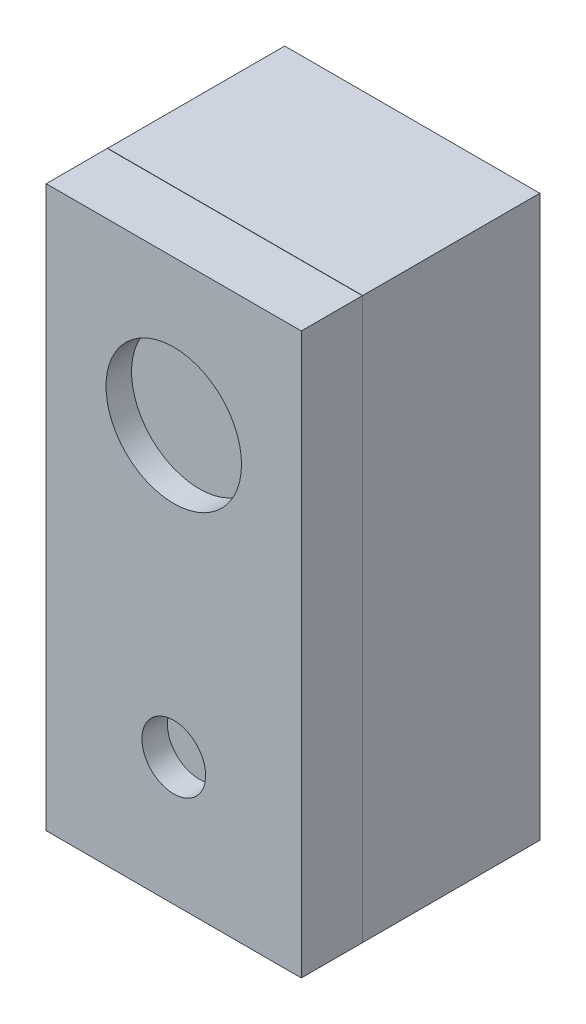
ISO-10303-21;
HEADER;
FILE_DESCRIPTION(('STEP AP214'),'2;1');
FILE_NAME('part.step','',(''),(''),'','','');
FILE_SCHEMA(('AUTOMOTIVE_DESIGN { 1 0 10303 214 1 1 1 1 }'));
ENDSEC;
DATA;
#1=APPLICATION_CONTEXT('core data for automotive mechanical design processes');
#2=APPLICATION_PROTOCOL_DEFINITION('international standard','automotive_design',2000,#1);
#3=PRODUCT_CONTEXT('',#1,'mechanical');
#4=PRODUCT('Part','Part','',(#3));
#5=PRODUCT_RELATED_PRODUCT_CATEGORY('part','',(#4));
#6=PRODUCT_DEFINITION_FORMATION('','',#4);
#7=PRODUCT_DEFINITION_CONTEXT('part definition',#1,'design');
#8=PRODUCT_DEFINITION('design','',#6,#7);
#9=PRODUCT_DEFINITION_SHAPE('','',#8);
#10=(LENGTH_UNIT() NAMED_UNIT(*) SI_UNIT(.MILLI.,.METRE.));
#11=(NAMED_UNIT(*) PLANE_ANGLE_UNIT() SI_UNIT($,.RADIAN.));
#12=(NAMED_UNIT(*) SI_UNIT($,.STERADIAN.) SOLID_ANGLE_UNIT());
#13=UNCERTAINTY_MEASURE_WITH_UNIT(LENGTH_MEASURE(1.E-05),#10,'distance_accuracy_value','');
#14=(GEOMETRIC_REPRESENTATION_CONTEXT(3) GLOBAL_UNCERTAINTY_ASSIGNED_CONTEXT((#13)) GLOBAL_UNIT_ASSIGNED_CONTEXT((#10,
#11,#12)) REPRESENTATION_CONTEXT('',''));
#15=CARTESIAN_POINT('',(0.,0.,0.));
#16=DIRECTION('',(0.,0.,1.));
#17=DIRECTION('',(1.,0.,0.));
#18=AXIS2_PLACEMENT_3D('',#15,#16,#17);
#19=CARTESIAN_POINT('',(-12.7,27.9019,11.8745));
#20=DIRECTION('',(1.,0.,0.));
#21=DIRECTION('',(0.,1.,0.));
#22=AXIS2_PLACEMENT_3D('',#19,#20,#21);
#23=PLANE('',#22);
#24=DIRECTION('',(0.,0.,-1.));
#25=VECTOR('',#24,1.);
#26=CARTESIAN_POINT('',(-12.7,27.9019,11.8745));
#27=LINE('',#26,#25);
#28=CARTESIAN_POINT('',(-12.7,27.9019,11.8745));
#29=VERTEX_POINT('',#28);
#30=CARTESIAN_POINT('',(-12.7,27.9019,5.7912));
#31=VERTEX_POINT('',#30);
#32=EDGE_CURVE('E191',#29,#31,#27,.T.);
#33=ORIENTED_EDGE('',*,*,#32,.T.);
#34=DIRECTION('',(0.,-1.,0.));
#35=VECTOR('',#34,1.);
#36=CARTESIAN_POINT('',(-12.7,27.9019,5.7912));
#37=LINE('',#36,#35);
#38=CARTESIAN_POINT('',(-12.7,-27.9019,5.7912));
#39=VERTEX_POINT('',#38);
#40=EDGE_CURVE('E37',#31,#39,#37,.T.);
#41=ORIENTED_EDGE('',*,*,#40,.T.);
#42=DIRECTION('',(0.,0.,-1.));
#43=VECTOR('',#42,1.);
#44=CARTESIAN_POINT('',(-12.7,-27.9019,11.8745));
#45=LINE('',#44,#43);
#46=CARTESIAN_POINT('',(-12.7,-27.9019,11.8745));
#47=VERTEX_POINT('',#46);
#48=EDGE_CURVE('E203',#47,#39,#45,.T.);
#49=ORIENTED_EDGE('',*,*,#48,.F.);
#50=DIRECTION('',(0.,-1.,0.));
#51=VECTOR('',#50,1.);
#52=CARTESIAN_POINT('',(-12.7,27.9019,11.8745));
#53=LINE('',#52,#51);
#54=EDGE_CURVE('E181',#29,#47,#53,.T.);
#55=ORIENTED_EDGE('',*,*,#54,.F.);
#56=EDGE_LOOP('',(#33,#41,#49,#55));
#57=FACE_BOUND('',#56,.T.);
#58=ADVANCED_FACE('F16',(#57),#23,.F.);
#59=CARTESIAN_POINT('',(-12.7,-27.9019,11.8745));
#60=DIRECTION('',(0.,1.,0.));
#61=DIRECTION('',(0.,0.,1.));
#62=AXIS2_PLACEMENT_3D('',#59,#60,#61);
#63=PLANE('',#62);
#64=ORIENTED_EDGE('',*,*,#48,.T.);
#65=DIRECTION('',(1.,0.,0.));
#66=VECTOR('',#65,1.);
#67=CARTESIAN_POINT('',(-12.7,-27.9019,5.7912));
#68=LINE('',#67,#66);
#69=CARTESIAN_POINT('',(12.7,-27.9019,5.7912));
#70=VERTEX_POINT('',#69);
#71=EDGE_CURVE('E148',#39,#70,#68,.T.);
#72=ORIENTED_EDGE('',*,*,#71,.T.);
#73=DIRECTION('',(0.,0.,-1.));
#74=VECTOR('',#73,1.);
#75=CARTESIAN_POINT('',(12.7,-27.9019,11.8745));
#76=LINE('',#75,#74);
#77=CARTESIAN_POINT('',(12.7,-27.9019,11.8745));
#78=VERTEX_POINT('',#77);
#79=EDGE_CURVE('E199',#78,#70,#76,.T.);
#80=ORIENTED_EDGE('',*,*,#79,.F.);
#81=DIRECTION('',(1.,0.,0.));
#82=VECTOR('',#81,1.);
#83=CARTESIAN_POINT('',(-12.7,-27.9019,11.8745));
#84=LINE('',#83,#82);
#85=EDGE_CURVE('E184',#47,#78,#84,.T.);
#86=ORIENTED_EDGE('',*,*,#85,.F.);
#87=EDGE_LOOP('',(#64,#72,#80,#86));
#88=FACE_BOUND('',#87,.T.);
#89=ADVANCED_FACE('F220',(#88),#63,.F.);
#90=CARTESIAN_POINT('',(12.7,27.9019,11.8745));
#91=DIRECTION('',(-1.,0.,0.));
#92=DIRECTION('',(0.,-1.,0.));
#93=AXIS2_PLACEMENT_3D('',#90,#91,#92);
#94=PLANE('',#93);
#95=ORIENTED_EDGE('',*,*,#79,.T.);
#96=DIRECTION('',(0.,1.,0.));
#97=VECTOR('',#96,1.);
#98=CARTESIAN_POINT('',(12.7,27.9019,5.7912));
#99=LINE('',#98,#97);
#100=CARTESIAN_POINT('',(12.7,27.9019,5.7912));
#101=VERTEX_POINT('',#100);
#102=EDGE_CURVE('E143',#70,#101,#99,.T.);
#103=ORIENTED_EDGE('',*,*,#102,.T.);
#104=DIRECTION('',(0.,0.,-1.));
#105=VECTOR('',#104,1.);
#106=CARTESIAN_POINT('',(12.7,27.9019,11.8745));
#107=LINE('',#106,#105);
#108=CARTESIAN_POINT('',(12.7,27.9019,11.8745));
#109=VERTEX_POINT('',#108);
#110=EDGE_CURVE('E195',#109,#101,#107,.T.);
#111=ORIENTED_EDGE('',*,*,#110,.F.);
#112=DIRECTION('',(0.,1.,0.));
#113=VECTOR('',#112,1.);
#114=CARTESIAN_POINT('',(12.7,27.9019,11.8745));
#115=LINE('',#114,#113);
#116=EDGE_CURVE('E186',#78,#109,#115,.T.);
#117=ORIENTED_EDGE('',*,*,#116,.F.);
#118=EDGE_LOOP('',(#95,#103,#111,#117));
#119=FACE_BOUND('',#118,.T.);
#120=ADVANCED_FACE('F218',(#119),#94,.F.);
#121=CARTESIAN_POINT('',(-12.7,27.9019,11.8745));
#122=DIRECTION('',(0.,-1.,0.));
#123=DIRECTION('',(0.,0.,-1.));
#124=AXIS2_PLACEMENT_3D('',#121,#122,#123);
#125=PLANE('',#124);
#126=ORIENTED_EDGE('',*,*,#110,.T.);
#127=DIRECTION('',(-1.,0.,0.));
#128=VECTOR('',#127,1.);
#129=CARTESIAN_POINT('',(-12.7,27.9019,5.7912));
#130=LINE('',#129,#128);
#131=EDGE_CURVE('E23',#101,#31,#130,.T.);
#132=ORIENTED_EDGE('',*,*,#131,.T.);
#133=ORIENTED_EDGE('',*,*,#32,.F.);
#134=DIRECTION('',(-1.,0.,0.));
#135=VECTOR('',#134,1.);
#136=CARTESIAN_POINT('',(-12.7,27.9019,11.8745));
#137=LINE('',#136,#135);
#138=EDGE_CURVE('E188',#109,#29,#137,.T.);
#139=ORIENTED_EDGE('',*,*,#138,.F.);
#140=EDGE_LOOP('',(#126,#132,#133,#139));
#141=FACE_BOUND('',#140,.T.);
#142=ADVANCED_FACE('F207',(#141),#125,.F.);
#143=CARTESIAN_POINT('',(-12.7,-27.9019,11.8745));
#144=DIRECTION('',(0.,0.,1.));
#145=DIRECTION('',(1.,0.,0.));
#146=AXIS2_PLACEMENT_3D('',#143,#144,#145);
#147=PLANE('',#146);
#148=CARTESIAN_POINT('',(0.,-15.2019,11.8745));
#149=DIRECTION('',(0.,0.,1.));
#150=DIRECTION('',(1.,0.,0.));
#151=AXIS2_PLACEMENT_3D('',#148,#149,#150);
#152=CIRCLE('',#151,3.175);
#153=CARTESIAN_POINT('',(3.175,-15.2019,11.8745));
#154=VERTEX_POINT('',#153);
#155=EDGE_CURVE('E157',#154,#154,#152,.T.);
#156=ORIENTED_EDGE('',*,*,#155,.F.);
#157=EDGE_LOOP('',(#156));
#158=FACE_BOUND('',#157,.T.);
#159=CARTESIAN_POINT('',(0.,13.4112,11.8745));
#160=DIRECTION('',(0.,0.,1.));
#161=DIRECTION('',(1.,0.,0.));
#162=AXIS2_PLACEMENT_3D('',#159,#160,#161);
#163=CIRCLE('',#162,6.746875);
#164=CARTESIAN_POINT('',(6.746875,13.4112,11.8745));
#165=VERTEX_POINT('',#164);
#166=EDGE_CURVE('E163',#165,#165,#163,.T.);
#167=ORIENTED_EDGE('',*,*,#166,.F.);
#168=EDGE_LOOP('',(#167));
#169=FACE_BOUND('',#168,.T.);
#170=ORIENTED_EDGE('',*,*,#54,.T.);
#171=ORIENTED_EDGE('',*,*,#85,.T.);
#172=ORIENTED_EDGE('',*,*,#116,.T.);
#173=ORIENTED_EDGE('',*,*,#138,.T.);
#174=EDGE_LOOP('',(#170,#171,#172,#173));
#175=FACE_BOUND('',#174,.T.);
#176=ADVANCED_FACE('F214',(#158,#169,#175),#147,.T.);
#177=CARTESIAN_POINT('',(0.,13.4112,9.3345));
#178=DIRECTION('',(0.,0.,1.));
#179=DIRECTION('',(1.,0.,0.));
#180=AXIS2_PLACEMENT_3D('',#177,#178,#179);
#181=CYLINDRICAL_SURFACE('',#180,6.746875);
#182=CARTESIAN_POINT('',(0.,13.4112,9.3345));
#183=DIRECTION('',(0.,0.,1.));
#184=DIRECTION('',(1.,0.,0.));
#185=AXIS2_PLACEMENT_3D('',#182,#183,#184);
#186=CIRCLE('',#185,6.746875);
#187=CARTESIAN_POINT('',(6.746875,13.4112,9.3345));
#188=VERTEX_POINT('',#187);
#189=EDGE_CURVE('E166',#188,#188,#186,.T.);
#190=ORIENTED_EDGE('',*,*,#189,.F.);
#191=EDGE_LOOP('',(#190));
#192=FACE_BOUND('',#191,.T.);
#193=ORIENTED_EDGE('',*,*,#166,.T.);
#194=EDGE_LOOP('',(#193));
#195=FACE_BOUND('',#194,.T.);
#196=ADVANCED_FACE('F276',(#192,#195),#181,.F.);
#197=CARTESIAN_POINT('',(0.,13.4112,9.3345));
#198=DIRECTION('',(0.,0.,1.));
#199=DIRECTION('',(1.,0.,0.));
#200=AXIS2_PLACEMENT_3D('',#197,#198,#199);
#201=PLANE('',#200);
#202=ORIENTED_EDGE('',*,*,#189,.T.);
#203=EDGE_LOOP('',(#202));
#204=FACE_BOUND('',#203,.T.);
#205=ADVANCED_FACE('F272',(#204),#201,.T.);
#206=CARTESIAN_POINT('',(0.,-15.2019,0.354243878930845));
#207=DIRECTION('',(0.,0.,1.));
#208=DIRECTION('',(1.,0.,0.));
#209=AXIS2_PLACEMENT_3D('',#206,#207,#208);
#210=CYLINDRICAL_SURFACE('',#209,3.175);
#211=CARTESIAN_POINT('',(0.,-15.2019,9.3345));
#212=DIRECTION('',(0.,0.,1.));
#213=DIRECTION('',(1.,0.,0.));
#214=AXIS2_PLACEMENT_3D('',#211,#212,#213);
#215=CIRCLE('',#214,3.175);
#216=CARTESIAN_POINT('',(3.175,-15.2019,9.3345));
#217=VERTEX_POINT('',#216);
#218=EDGE_CURVE('E160',#217,#217,#215,.F.);
#219=ORIENTED_EDGE('',*,*,#218,.T.);
#220=EDGE_LOOP('',(#219));
#221=FACE_BOUND('',#220,.T.);
#222=ORIENTED_EDGE('',*,*,#155,.T.);
#223=EDGE_LOOP('',(#222));
#224=FACE_BOUND('',#223,.T.);
#225=ADVANCED_FACE('F264',(#221,#224),#210,.F.);
#226=CARTESIAN_POINT('',(0.,13.4112,9.3345));
#227=DIRECTION('',(0.,0.,1.));
#228=DIRECTION('',(1.,0.,0.));
#229=AXIS2_PLACEMENT_3D('',#226,#227,#228);
#230=PLANE('',#229);
#231=ORIENTED_EDGE('',*,*,#218,.F.);
#232=EDGE_LOOP('',(#231));
#233=FACE_BOUND('',#232,.T.);
#234=ADVANCED_FACE('F255',(#233),#230,.T.);
#235=CARTESIAN_POINT('',(0.,0.,5.7658));
#236=DIRECTION('',(0.,0.,1.));
#237=DIRECTION('',(1.,0.,0.));
#238=AXIS2_PLACEMENT_3D('',#235,#236,#237);
#239=PLANE('',#238);
#240=DIRECTION('',(0.,-1.,0.));
#241=VECTOR('',#240,1.);
#242=CARTESIAN_POINT('',(-12.573,27.7749,5.7658));
#243=LINE('',#242,#241);
#244=CARTESIAN_POINT('',(-12.573,27.7749,5.7658));
#245=VERTEX_POINT('',#244);
#246=CARTESIAN_POINT('',(-12.573,-27.7749,5.7658));
#247=VERTEX_POINT('',#246);
#248=EDGE_CURVE('E138',#245,#247,#243,.T.);
#249=ORIENTED_EDGE('',*,*,#248,.F.);
#250=DIRECTION('',(-1.,0.,0.));
#251=VECTOR('',#250,1.);
#252=CARTESIAN_POINT('',(12.573,27.7749,5.7658));
#253=LINE('',#252,#251);
#254=CARTESIAN_POINT('',(12.573,27.7749,5.7658));
#255=VERTEX_POINT('',#254);
#256=EDGE_CURVE('E136',#255,#245,#253,.T.);
#257=ORIENTED_EDGE('',*,*,#256,.F.);
#258=DIRECTION('',(0.,1.,0.));
#259=VECTOR('',#258,1.);
#260=CARTESIAN_POINT('',(12.573,-27.7749,5.7658));
#261=LINE('',#260,#259);
#262=CARTESIAN_POINT('',(12.573,-27.7749,5.7658));
#263=VERTEX_POINT('',#262);
#264=EDGE_CURVE('E109',#263,#255,#261,.T.);
#265=ORIENTED_EDGE('',*,*,#264,.F.);
#266=DIRECTION('',(1.,0.,0.));
#267=VECTOR('',#266,1.);
#268=CARTESIAN_POINT('',(-12.573,-27.7749,5.7658));
#269=LINE('',#268,#267);
#270=EDGE_CURVE('E129',#247,#263,#269,.T.);
#271=ORIENTED_EDGE('',*,*,#270,.F.);
#272=EDGE_LOOP('',(#249,#257,#265,#271));
#273=FACE_BOUND('',#272,.T.);
#274=DIRECTION('',(0.,-1.,0.));
#275=VECTOR('',#274,1.);
#276=CARTESIAN_POINT('',(-12.7,27.9019,5.7658));
#277=LINE('',#276,#275);
#278=CARTESIAN_POINT('',(-12.7,27.9019,5.7658));
#279=VERTEX_POINT('',#278);
#280=CARTESIAN_POINT('',(-12.7,-27.9019,5.7658));
#281=VERTEX_POINT('',#280);
#282=EDGE_CURVE('E155',#279,#281,#277,.T.);
#283=ORIENTED_EDGE('',*,*,#282,.T.);
#284=DIRECTION('',(1.,0.,0.));
#285=VECTOR('',#284,1.);
#286=CARTESIAN_POINT('',(-12.7,-27.9019,5.7658));
#287=LINE('',#286,#285);
#288=CARTESIAN_POINT('',(12.7,-27.9019,5.7658));
#289=VERTEX_POINT('',#288);
#290=EDGE_CURVE('E153',#281,#289,#287,.T.);
#291=ORIENTED_EDGE('',*,*,#290,.T.);
#292=DIRECTION('',(0.,1.,0.));
#293=VECTOR('',#292,1.);
#294=CARTESIAN_POINT('',(12.7,27.9019,5.7658));
#295=LINE('',#294,#293);
#296=CARTESIAN_POINT('',(12.7,27.9019,5.7658));
#297=VERTEX_POINT('',#296);
#298=EDGE_CURVE('E29',#289,#297,#295,.T.);
#299=ORIENTED_EDGE('',*,*,#298,.T.);
#300=DIRECTION('',(-1.,0.,0.));
#301=VECTOR('',#300,1.);
#302=CARTESIAN_POINT('',(-12.7,27.9019,5.7658));
#303=LINE('',#302,#301);
#304=EDGE_CURVE('E11',#297,#279,#303,.T.);
#305=ORIENTED_EDGE('',*,*,#304,.T.);
#306=EDGE_LOOP('',(#283,#291,#299,#305));
#307=FACE_BOUND('',#306,.T.);
#308=ADVANCED_FACE('F253',(#273,#307),#239,.T.);
#309=CARTESIAN_POINT('',(0.,0.,5.7912));
#310=DIRECTION('',(0.,0.,1.));
#311=DIRECTION('',(1.,0.,0.));
#312=AXIS2_PLACEMENT_3D('',#309,#310,#311);
#313=PLANE('',#312);
#314=DIRECTION('',(1.,0.,0.));
#315=VECTOR('',#314,1.);
#316=CARTESIAN_POINT('',(-12.573,-27.7749,5.7912));
#317=LINE('',#316,#315);
#318=CARTESIAN_POINT('',(-12.573,-27.7749,5.7912));
#319=VERTEX_POINT('',#318);
#320=CARTESIAN_POINT('',(12.573,-27.7749,5.7912));
#321=VERTEX_POINT('',#320);
#322=EDGE_CURVE('E123',#319,#321,#317,.T.);
#323=ORIENTED_EDGE('',*,*,#322,.T.);
#324=DIRECTION('',(0.,1.,0.));
#325=VECTOR('',#324,1.);
#326=CARTESIAN_POINT('',(12.573,-27.7749,5.7912));
#327=LINE('',#326,#325);
#328=CARTESIAN_POINT('',(12.573,27.7749,5.7912));
#329=VERTEX_POINT('',#328);
#330=EDGE_CURVE('E107',#321,#329,#327,.T.);
#331=ORIENTED_EDGE('',*,*,#330,.T.);
#332=DIRECTION('',(-1.,0.,0.));
#333=VECTOR('',#332,1.);
#334=CARTESIAN_POINT('',(12.573,27.7749,5.7912));
#335=LINE('',#334,#333);
#336=CARTESIAN_POINT('',(-12.573,27.7749,5.7912));
#337=VERTEX_POINT('',#336);
#338=EDGE_CURVE('E120',#329,#337,#335,.T.);
#339=ORIENTED_EDGE('',*,*,#338,.T.);
#340=DIRECTION('',(0.,-1.,0.));
#341=VECTOR('',#340,1.);
#342=CARTESIAN_POINT('',(-12.573,27.7749,5.7912));
#343=LINE('',#342,#341);
#344=EDGE_CURVE('E127',#337,#319,#343,.T.);
#345=ORIENTED_EDGE('',*,*,#344,.T.);
#346=EDGE_LOOP('',(#323,#331,#339,#345));
#347=FACE_BOUND('',#346,.T.);
#348=ORIENTED_EDGE('',*,*,#131,.F.);
#349=ORIENTED_EDGE('',*,*,#102,.F.);
#350=ORIENTED_EDGE('',*,*,#71,.F.);
#351=ORIENTED_EDGE('',*,*,#40,.F.);
#352=EDGE_LOOP('',(#348,#349,#350,#351));
#353=FACE_BOUND('',#352,.T.);
#354=ADVANCED_FACE('F118',(#347,#353),#313,.F.);
#355=CARTESIAN_POINT('',(-12.573,-27.7749,5.7658));
#356=DIRECTION('',(0.,-1.,0.));
#357=DIRECTION('',(0.,0.,-1.));
#358=AXIS2_PLACEMENT_3D('',#355,#356,#357);
#359=PLANE('',#358);
#360=ORIENTED_EDGE('',*,*,#322,.F.);
#361=DIRECTION('',(0.,0.,1.));
#362=VECTOR('',#361,1.);
#363=CARTESIAN_POINT('',(-12.573,-27.7749,5.7658));
#364=LINE('',#363,#362);
#365=EDGE_CURVE('E141',#247,#319,#364,.T.);
#366=ORIENTED_EDGE('',*,*,#365,.F.);
#367=ORIENTED_EDGE('',*,*,#270,.T.);
#368=DIRECTION('',(0.,0.,1.));
#369=VECTOR('',#368,1.);
#370=CARTESIAN_POINT('',(12.573,-27.7749,5.7658));
#371=LINE('',#370,#369);
#372=EDGE_CURVE('E114',#263,#321,#371,.T.);
#373=ORIENTED_EDGE('',*,*,#372,.T.);
#374=EDGE_LOOP('',(#360,#366,#367,#373));
#375=FACE_BOUND('',#374,.T.);
#376=ADVANCED_FACE('F262',(#375),#359,.T.);
#377=CARTESIAN_POINT('',(-12.573,27.7749,5.7658));
#378=DIRECTION('',(-1.,0.,0.));
#379=DIRECTION('',(0.,-1.,0.));
#380=AXIS2_PLACEMENT_3D('',#377,#378,#379);
#381=PLANE('',#380);
#382=ORIENTED_EDGE('',*,*,#344,.F.);
#383=DIRECTION('',(0.,0.,1.));
#384=VECTOR('',#383,1.);
#385=CARTESIAN_POINT('',(-12.573,27.7749,5.7658));
#386=LINE('',#385,#384);
#387=EDGE_CURVE('E113',#245,#337,#386,.T.);
#388=ORIENTED_EDGE('',*,*,#387,.F.);
#389=ORIENTED_EDGE('',*,*,#248,.T.);
#390=ORIENTED_EDGE('',*,*,#365,.T.);
#391=EDGE_LOOP('',(#382,#388,#389,#390));
#392=FACE_BOUND('',#391,.T.);
#393=ADVANCED_FACE('F395',(#392),#381,.T.);
#394=CARTESIAN_POINT('',(12.573,27.7749,5.7658));
#395=DIRECTION('',(0.,1.,0.));
#396=DIRECTION('',(0.,0.,1.));
#397=AXIS2_PLACEMENT_3D('',#394,#395,#396);
#398=PLANE('',#397);
#399=ORIENTED_EDGE('',*,*,#338,.F.);
#400=DIRECTION('',(0.,0.,1.));
#401=VECTOR('',#400,1.);
#402=CARTESIAN_POINT('',(12.573,27.7749,5.7658));
#403=LINE('',#402,#401);
#404=EDGE_CURVE('E104',#255,#329,#403,.T.);
#405=ORIENTED_EDGE('',*,*,#404,.F.);
#406=ORIENTED_EDGE('',*,*,#256,.T.);
#407=ORIENTED_EDGE('',*,*,#387,.T.);
#408=EDGE_LOOP('',(#399,#405,#406,#407));
#409=FACE_BOUND('',#408,.T.);
#410=ADVANCED_FACE('F126',(#409),#398,.T.);
#411=CARTESIAN_POINT('',(12.573,-27.7749,5.7658));
#412=DIRECTION('',(1.,0.,0.));
#413=DIRECTION('',(0.,1.,0.));
#414=AXIS2_PLACEMENT_3D('',#411,#412,#413);
#415=PLANE('',#414);
#416=ORIENTED_EDGE('',*,*,#330,.F.);
#417=ORIENTED_EDGE('',*,*,#372,.F.);
#418=ORIENTED_EDGE('',*,*,#264,.T.);
#419=ORIENTED_EDGE('',*,*,#404,.T.);
#420=EDGE_LOOP('',(#416,#417,#418,#419));
#421=FACE_BOUND('',#420,.T.);
#422=ADVANCED_FACE('F106',(#421),#415,.T.);
#423=CARTESIAN_POINT('',(-12.7,-27.9019,-11.8745));
#424=DIRECTION('',(0.,0.,1.));
#425=DIRECTION('',(1.,0.,0.));
#426=AXIS2_PLACEMENT_3D('',#423,#424,#425);
#427=PLANE('',#426);
#428=DIRECTION('',(0.,-1.,0.));
#429=VECTOR('',#428,1.);
#430=CARTESIAN_POINT('',(-12.7,27.9019,-11.8745));
#431=LINE('',#430,#429);
#432=CARTESIAN_POINT('',(-12.7,27.9019,-11.8745));
#433=VERTEX_POINT('',#432);
#434=CARTESIAN_POINT('',(-12.7,-27.9019,-11.8745));
#435=VERTEX_POINT('',#434);
#436=EDGE_CURVE('E169',#433,#435,#431,.T.);
#437=ORIENTED_EDGE('',*,*,#436,.F.);
#438=DIRECTION('',(-1.,0.,0.));
#439=VECTOR('',#438,1.);
#440=CARTESIAN_POINT('',(-12.7,27.9019,-11.8745));
#441=LINE('',#440,#439);
#442=CARTESIAN_POINT('',(12.7,27.9019,-11.8745));
#443=VERTEX_POINT('',#442);
#444=EDGE_CURVE('E178',#443,#433,#441,.T.);
#445=ORIENTED_EDGE('',*,*,#444,.F.);
#446=DIRECTION('',(0.,1.,0.));
#447=VECTOR('',#446,1.);
#448=CARTESIAN_POINT('',(12.7,27.9019,-11.8745));
#449=LINE('',#448,#447);
#450=CARTESIAN_POINT('',(12.7,-27.9019,-11.8745));
#451=VERTEX_POINT('',#450);
#452=EDGE_CURVE('E175',#451,#443,#449,.T.);
#453=ORIENTED_EDGE('',*,*,#452,.F.);
#454=DIRECTION('',(1.,0.,0.));
#455=VECTOR('',#454,1.);
#456=CARTESIAN_POINT('',(-12.7,-27.9019,-11.8745));
#457=LINE('',#456,#455);
#458=EDGE_CURVE('E172',#435,#451,#457,.T.);
#459=ORIENTED_EDGE('',*,*,#458,.F.);
#460=EDGE_LOOP('',(#437,#445,#453,#459));
#461=FACE_BOUND('',#460,.T.);
#462=ADVANCED_FACE('F249',(#461),#427,.F.);
#463=ORIENTED_EDGE('',*,*,#304,.F.);
#464=EDGE_CURVE('E194',#297,#443,#107,.T.);
#465=ORIENTED_EDGE('',*,*,#464,.T.);
#466=ORIENTED_EDGE('',*,*,#444,.T.);
#467=EDGE_CURVE('E190',#279,#433,#27,.T.);
#468=ORIENTED_EDGE('',*,*,#467,.F.);
#469=EDGE_LOOP('',(#463,#465,#466,#468));
#470=FACE_BOUND('',#469,.T.);
#471=ADVANCED_FACE('F238',(#470),#125,.F.);
#472=ORIENTED_EDGE('',*,*,#298,.F.);
#473=EDGE_CURVE('E198',#289,#451,#76,.T.);
#474=ORIENTED_EDGE('',*,*,#473,.T.);
#475=ORIENTED_EDGE('',*,*,#452,.T.);
#476=ORIENTED_EDGE('',*,*,#464,.F.);
#477=EDGE_LOOP('',(#472,#474,#475,#476));
#478=FACE_BOUND('',#477,.T.);
#479=ADVANCED_FACE('F229',(#478),#94,.F.);
#480=ORIENTED_EDGE('',*,*,#290,.F.);
#481=EDGE_CURVE('E202',#281,#435,#45,.T.);
#482=ORIENTED_EDGE('',*,*,#481,.T.);
#483=ORIENTED_EDGE('',*,*,#458,.T.);
#484=ORIENTED_EDGE('',*,*,#473,.F.);
#485=EDGE_LOOP('',(#480,#482,#483,#484));
#486=FACE_BOUND('',#485,.T.);
#487=ADVANCED_FACE('F222',(#486),#63,.F.);
#488=ORIENTED_EDGE('',*,*,#282,.F.);
#489=ORIENTED_EDGE('',*,*,#467,.T.);
#490=ORIENTED_EDGE('',*,*,#436,.T.);
#491=ORIENTED_EDGE('',*,*,#481,.F.);
#492=EDGE_LOOP('',(#488,#489,#490,#491));
#493=FACE_BOUND('',#492,.T.);
#494=ADVANCED_FACE('F230',(#493),#23,.F.);
#495=CLOSED_SHELL('',(#58,#89,#120,#142,#176,#196,#205,#225,#234,#308,#354,#376,#393,#410,#422,
#462,#471,#479,#487,#494));
#496=MANIFOLD_SOLID_BREP('B1',#495);
#497=ADVANCED_BREP_SHAPE_REPRESENTATION('',(#18,#496),#14);
#498=SHAPE_DEFINITION_REPRESENTATION(#9,#497);
ENDSEC;
END-ISO-10303-21;
